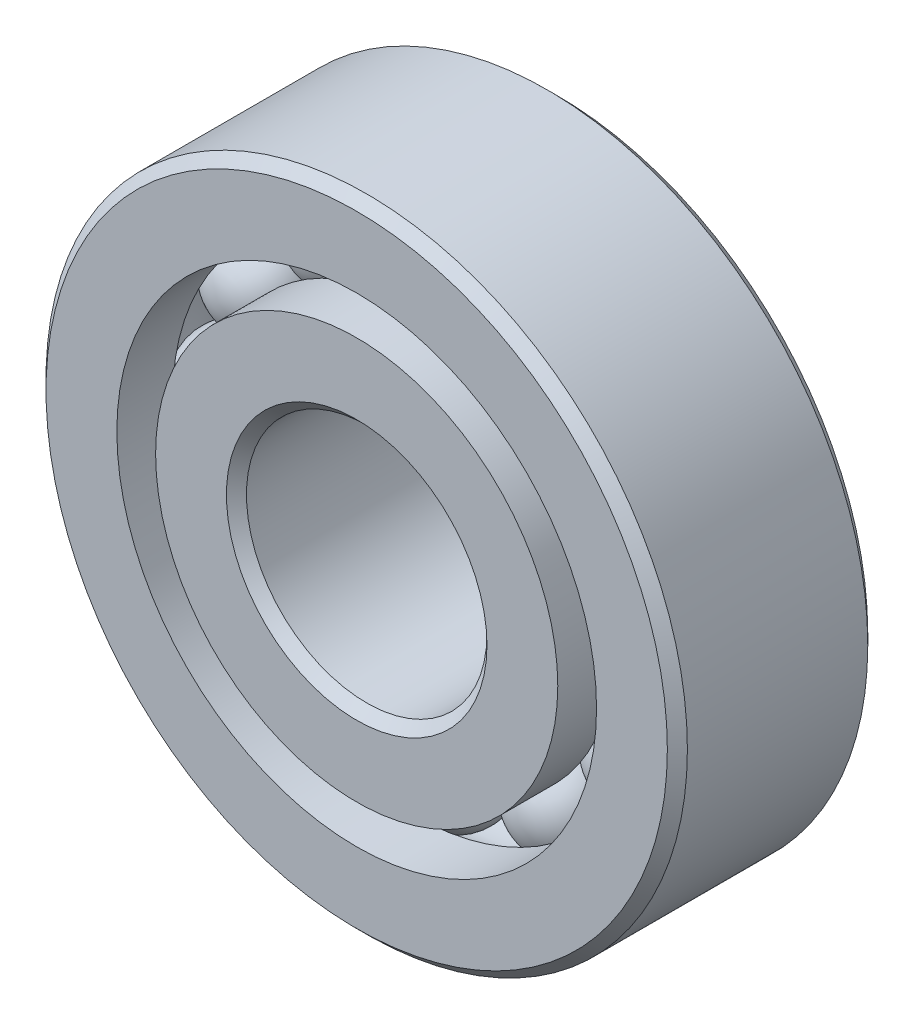
ISO-10303-21;
HEADER;
FILE_DESCRIPTION(('STEP AP214'),'2;1');
FILE_NAME('part.step','',(''),(''),'','','');
FILE_SCHEMA(('AUTOMOTIVE_DESIGN { 1 0 10303 214 1 1 1 1 }'));
ENDSEC;
DATA;
#1=APPLICATION_CONTEXT('core data for automotive mechanical design processes');
#2=APPLICATION_PROTOCOL_DEFINITION('international standard','automotive_design',2000,#1);
#3=PRODUCT_CONTEXT('',#1,'mechanical');
#4=PRODUCT('Part','Part','',(#3));
#5=PRODUCT_RELATED_PRODUCT_CATEGORY('part','',(#4));
#6=PRODUCT_DEFINITION_FORMATION('','',#4);
#7=PRODUCT_DEFINITION_CONTEXT('part definition',#1,'design');
#8=PRODUCT_DEFINITION('design','',#6,#7);
#9=PRODUCT_DEFINITION_SHAPE('','',#8);
#10=(LENGTH_UNIT() NAMED_UNIT(*) SI_UNIT(.MILLI.,.METRE.));
#11=(NAMED_UNIT(*) PLANE_ANGLE_UNIT() SI_UNIT($,.RADIAN.));
#12=(NAMED_UNIT(*) SI_UNIT($,.STERADIAN.) SOLID_ANGLE_UNIT());
#13=UNCERTAINTY_MEASURE_WITH_UNIT(LENGTH_MEASURE(1.E-05),#10,'distance_accuracy_value','');
#14=(GEOMETRIC_REPRESENTATION_CONTEXT(3) GLOBAL_UNCERTAINTY_ASSIGNED_CONTEXT((#13)) GLOBAL_UNIT_ASSIGNED_CONTEXT((#10,
#11,#12)) REPRESENTATION_CONTEXT('',''));
#15=CARTESIAN_POINT('',(0.,0.,0.));
#16=DIRECTION('',(0.,0.,1.));
#17=DIRECTION('',(1.,0.,0.));
#18=AXIS2_PLACEMENT_3D('',#15,#16,#17);
#19=CARTESIAN_POINT('',(-2.18281249999995,3.78074215339647,0.));
#20=DIRECTION('',(0.,0.,1.));
#21=DIRECTION('',(-0.499999999999989,0.866025403784445,0.));
#22=AXIS2_PLACEMENT_3D('',#19,#20,#21);
#23=SPHERICAL_SURFACE('',#22,0.961832467237323);
#24=CARTESIAN_POINT('',(-2.18281249999995,3.78074215339647,0.961832467237323));
#25=VERTEX_POINT('',#24);
#26=VERTEX_LOOP('',#25);
#27=FACE_BOUND('',#26,.T.);
#28=ADVANCED_FACE('F39',(#27),#23,.T.);
#29=CLOSED_SHELL('',(#28));
#30=MANIFOLD_SOLID_BREP('B2',#29);
#31=CARTESIAN_POINT('',(-3.78074215339641,2.18281250000004,0.));
#32=DIRECTION('',(0.,0.,1.));
#33=DIRECTION('',(-0.866025403784433,0.50000000000001,0.));
#34=AXIS2_PLACEMENT_3D('',#31,#32,#33);
#35=SPHERICAL_SURFACE('',#34,0.961832467237323);
#36=CARTESIAN_POINT('',(-3.78074215339641,2.18281250000004,0.961832467237323));
#37=VERTEX_POINT('',#36);
#38=VERTEX_LOOP('',#37);
#39=FACE_BOUND('',#38,.T.);
#40=ADVANCED_FACE('F72',(#39),#35,.T.);
#41=CLOSED_SHELL('',(#40));
#42=MANIFOLD_SOLID_BREP('B6',#41);
#43=CARTESIAN_POINT('',(-4.365625,0.,0.));
#44=DIRECTION('',(0.,0.,1.));
#45=DIRECTION('',(-1.,0.,0.));
#46=AXIS2_PLACEMENT_3D('',#43,#44,#45);
#47=SPHERICAL_SURFACE('',#46,0.961832467237323);
#48=CARTESIAN_POINT('',(-4.365625,0.,0.961832467237323));
#49=VERTEX_POINT('',#48);
#50=VERTEX_LOOP('',#49);
#51=FACE_BOUND('',#50,.T.);
#52=ADVANCED_FACE('F105',(#51),#47,.T.);
#53=CLOSED_SHELL('',(#52));
#54=MANIFOLD_SOLID_BREP('B35',#53);
#55=CARTESIAN_POINT('',(-3.78074215339646,-2.18281249999996,0.));
#56=DIRECTION('',(0.,0.,1.));
#57=DIRECTION('',(-0.866025403784443,-0.499999999999992,0.));
#58=AXIS2_PLACEMENT_3D('',#55,#56,#57);
#59=SPHERICAL_SURFACE('',#58,0.961832467237323);
#60=CARTESIAN_POINT('',(-3.78074215339646,-2.18281249999996,0.961832467237323));
#61=VERTEX_POINT('',#60);
#62=VERTEX_LOOP('',#61);
#63=FACE_BOUND('',#62,.T.);
#64=ADVANCED_FACE('F138',(#63),#59,.T.);
#65=CLOSED_SHELL('',(#64));
#66=MANIFOLD_SOLID_BREP('B68',#65);
#67=CARTESIAN_POINT('',(-2.18281250000003,-3.78074215339642,0.));
#68=DIRECTION('',(0.,0.,1.));
#69=DIRECTION('',(-0.500000000000007,-0.866025403784435,0.));
#70=AXIS2_PLACEMENT_3D('',#67,#68,#69);
#71=SPHERICAL_SURFACE('',#70,0.961832467237323);
#72=CARTESIAN_POINT('',(-2.18281250000003,-3.78074215339642,0.961832467237323));
#73=VERTEX_POINT('',#72);
#74=VERTEX_LOOP('',#73);
#75=FACE_BOUND('',#74,.T.);
#76=ADVANCED_FACE('F169',(#75),#71,.T.);
#77=CLOSED_SHELL('',(#76));
#78=MANIFOLD_SOLID_BREP('B101',#77);
#79=CARTESIAN_POINT('',(0.,-4.365625,0.));
#80=DIRECTION('',(0.,0.,1.));
#81=DIRECTION('',(0.,-1.,0.));
#82=AXIS2_PLACEMENT_3D('',#79,#80,#81);
#83=SPHERICAL_SURFACE('',#82,0.961832467237323);
#84=CARTESIAN_POINT('',(0.,-4.365625,0.961832467237323));
#85=VERTEX_POINT('',#84);
#86=VERTEX_LOOP('',#85);
#87=FACE_BOUND('',#86,.T.);
#88=ADVANCED_FACE('F202',(#87),#83,.T.);
#89=CLOSED_SHELL('',(#88));
#90=MANIFOLD_SOLID_BREP('B134',#89);
#91=CARTESIAN_POINT('',(2.18281249999998,-3.78074215339645,0.));
#92=DIRECTION('',(0.,0.,1.));
#93=DIRECTION('',(0.499999999999995,-0.866025403784442,0.));
#94=AXIS2_PLACEMENT_3D('',#91,#92,#93);
#95=SPHERICAL_SURFACE('',#94,0.961832467237323);
#96=CARTESIAN_POINT('',(2.18281249999998,-3.78074215339645,0.961832467237323));
#97=VERTEX_POINT('',#96);
#98=VERTEX_LOOP('',#97);
#99=FACE_BOUND('',#98,.T.);
#100=ADVANCED_FACE('F233',(#99),#95,.T.);
#101=CLOSED_SHELL('',(#100));
#102=MANIFOLD_SOLID_BREP('B165',#101);
#103=CARTESIAN_POINT('',(3.78074215339643,-2.18281250000002,0.));
#104=DIRECTION('',(0.,0.,1.));
#105=DIRECTION('',(0.866025403784436,-0.500000000000004,0.));
#106=AXIS2_PLACEMENT_3D('',#103,#104,#105);
#107=SPHERICAL_SURFACE('',#106,0.961832467237323);
#108=CARTESIAN_POINT('',(3.78074215339643,-2.18281250000002,0.961832467237323));
#109=VERTEX_POINT('',#108);
#110=VERTEX_LOOP('',#109);
#111=FACE_BOUND('',#110,.T.);
#112=ADVANCED_FACE('F264',(#111),#107,.T.);
#113=CLOSED_SHELL('',(#112));
#114=MANIFOLD_SOLID_BREP('B198',#113);
#115=CARTESIAN_POINT('',(4.365625,0.,0.));
#116=DIRECTION('',(0.,0.,1.));
#117=DIRECTION('',(1.,0.,0.));
#118=AXIS2_PLACEMENT_3D('',#115,#116,#117);
#119=SPHERICAL_SURFACE('',#118,0.961832467237323);
#120=CARTESIAN_POINT('',(4.365625,0.,0.961832467237323));
#121=VERTEX_POINT('',#120);
#122=VERTEX_LOOP('',#121);
#123=FACE_BOUND('',#122,.T.);
#124=ADVANCED_FACE('F295',(#123),#119,.T.);
#125=CLOSED_SHELL('',(#124));
#126=MANIFOLD_SOLID_BREP('B229',#125);
#127=CARTESIAN_POINT('',(3.78074215339644,2.18281249999999,0.));
#128=DIRECTION('',(0.,0.,1.));
#129=DIRECTION('',(0.86602540378444,0.499999999999998,0.));
#130=AXIS2_PLACEMENT_3D('',#127,#128,#129);
#131=SPHERICAL_SURFACE('',#130,0.961832467237323);
#132=CARTESIAN_POINT('',(3.78074215339644,2.18281249999999,0.961832467237323));
#133=VERTEX_POINT('',#132);
#134=VERTEX_LOOP('',#133);
#135=FACE_BOUND('',#134,.T.);
#136=ADVANCED_FACE('F326',(#135),#131,.T.);
#137=CLOSED_SHELL('',(#136));
#138=MANIFOLD_SOLID_BREP('B260',#137);
#139=CARTESIAN_POINT('',(2.1828125,3.78074215339644,0.));
#140=DIRECTION('',(0.,0.,1.));
#141=DIRECTION('',(0.500000000000001,0.866025403784438,0.));
#142=AXIS2_PLACEMENT_3D('',#139,#140,#141);
#143=SPHERICAL_SURFACE('',#142,0.961832467237323);
#144=CARTESIAN_POINT('',(2.1828125,3.78074215339644,0.961832467237323));
#145=VERTEX_POINT('',#144);
#146=VERTEX_LOOP('',#145);
#147=FACE_BOUND('',#146,.T.);
#148=ADVANCED_FACE('F359',(#147),#143,.T.);
#149=CLOSED_SHELL('',(#148));
#150=MANIFOLD_SOLID_BREP('B291',#149);
#151=CARTESIAN_POINT('',(0.,4.365625,0.));
#152=DIRECTION('',(0.,0.,1.));
#153=DIRECTION('',(0.,1.,0.));
#154=AXIS2_PLACEMENT_3D('',#151,#152,#153);
#155=SPHERICAL_SURFACE('',#154,0.961832467237323);
#156=CARTESIAN_POINT('',(0.,4.365625,0.961832467237323));
#157=VERTEX_POINT('',#156);
#158=VERTEX_LOOP('',#157);
#159=FACE_BOUND('',#158,.T.);
#160=ADVANCED_FACE('F394',(#159),#155,.T.);
#161=CLOSED_SHELL('',(#160));
#162=MANIFOLD_SOLID_BREP('B322',#161);
#163=CARTESIAN_POINT('',(0.,3.98183379120879,1.984375));
#164=DIRECTION('',(0.,0.,-1.));
#165=DIRECTION('',(-1.,0.,0.));
#166=AXIS2_PLACEMENT_3D('',#163,#164,#165);
#167=PLANE('',#166);
#168=CARTESIAN_POINT('',(0.,0.,1.984375));
#169=DIRECTION('',(0.,0.,1.));
#170=DIRECTION('',(1.,0.,0.));
#171=AXIS2_PLACEMENT_3D('',#168,#169,#170);
#172=CIRCLE('',#171,2.5796875);
#173=CARTESIAN_POINT('',(2.5796875,0.,1.984375));
#174=VERTEX_POINT('',#173);
#175=EDGE_CURVE('E441',#174,#174,#172,.T.);
#176=ORIENTED_EDGE('',*,*,#175,.F.);
#177=EDGE_LOOP('',(#176));
#178=FACE_BOUND('',#177,.T.);
#179=CARTESIAN_POINT('',(0.,0.,1.984375));
#180=DIRECTION('',(0.,0.,1.));
#181=DIRECTION('',(1.,0.,0.));
#182=AXIS2_PLACEMENT_3D('',#179,#180,#181);
#183=CIRCLE('',#182,3.98183379120879);
#184=CARTESIAN_POINT('',(3.98183379120879,0.,1.984375));
#185=VERTEX_POINT('',#184);
#186=EDGE_CURVE('E393',#185,#185,#183,.T.);
#187=ORIENTED_EDGE('',*,*,#186,.T.);
#188=EDGE_LOOP('',(#187));
#189=FACE_BOUND('',#188,.T.);
#190=ADVANCED_FACE('F413',(#178,#189),#167,.F.);
#191=CARTESIAN_POINT('',(0.,0.,1.984375));
#192=DIRECTION('',(0.,0.,1.));
#193=DIRECTION('',(1.,0.,0.));
#194=AXIS2_PLACEMENT_3D('',#191,#192,#193);
#195=CYLINDRICAL_SURFACE('',#194,3.98183379120879);
#196=ORIENTED_EDGE('',*,*,#186,.F.);
#197=EDGE_LOOP('',(#196));
#198=FACE_BOUND('',#197,.T.);
#199=CARTESIAN_POINT('',(0.,0.,0.881944444444444));
#200=DIRECTION('',(0.,0.,1.));
#201=DIRECTION('',(1.,0.,0.));
#202=AXIS2_PLACEMENT_3D('',#199,#200,#201);
#203=CIRCLE('',#202,3.98183379120879);
#204=CARTESIAN_POINT('',(3.98183379120879,0.,0.881944444444444));
#205=VERTEX_POINT('',#204);
#206=EDGE_CURVE('E419',#205,#205,#203,.T.);
#207=ORIENTED_EDGE('',*,*,#206,.T.);
#208=EDGE_LOOP('',(#207));
#209=FACE_BOUND('',#208,.T.);
#210=ADVANCED_FACE('F448',(#198,#209),#195,.T.);
#211=CARTESIAN_POINT('',(0.,0.,0.));
#212=DIRECTION('',(0.,0.,1.));
#213=DIRECTION('',(1.,0.,0.));
#214=AXIS2_PLACEMENT_3D('',#211,#212,#213);
#215=TOROIDAL_SURFACE('',#214,4.365625,0.961832467237322);
#216=ORIENTED_EDGE('',*,*,#206,.F.);
#217=EDGE_LOOP('',(#216));
#218=FACE_BOUND('',#217,.T.);
#219=CARTESIAN_POINT('',(0.,0.,-0.881944444444446));
#220=DIRECTION('',(0.,0.,1.));
#221=DIRECTION('',(1.,0.,0.));
#222=AXIS2_PLACEMENT_3D('',#219,#220,#221);
#223=CIRCLE('',#222,3.98183379120879);
#224=CARTESIAN_POINT('',(3.98183379120879,0.,-0.881944444444446));
#225=VERTEX_POINT('',#224);
#226=EDGE_CURVE('E423',#225,#225,#223,.T.);
#227=ORIENTED_EDGE('',*,*,#226,.T.);
#228=EDGE_LOOP('',(#227));
#229=FACE_BOUND('',#228,.T.);
#230=ADVANCED_FACE('F452',(#218,#229),#215,.F.);
#231=CARTESIAN_POINT('',(0.,0.,1.984375));
#232=DIRECTION('',(0.,0.,1.));
#233=DIRECTION('',(1.,0.,0.));
#234=AXIS2_PLACEMENT_3D('',#231,#232,#233);
#235=CYLINDRICAL_SURFACE('',#234,3.98183379120879);
#236=ORIENTED_EDGE('',*,*,#226,.F.);
#237=EDGE_LOOP('',(#236));
#238=FACE_BOUND('',#237,.T.);
#239=CARTESIAN_POINT('',(0.,0.,-1.984375));
#240=DIRECTION('',(0.,0.,1.));
#241=DIRECTION('',(1.,0.,0.));
#242=AXIS2_PLACEMENT_3D('',#239,#240,#241);
#243=CIRCLE('',#242,3.98183379120879);
#244=CARTESIAN_POINT('',(3.98183379120879,0.,-1.984375));
#245=VERTEX_POINT('',#244);
#246=EDGE_CURVE('E427',#245,#245,#243,.T.);
#247=ORIENTED_EDGE('',*,*,#246,.T.);
#248=EDGE_LOOP('',(#247));
#249=FACE_BOUND('',#248,.T.);
#250=ADVANCED_FACE('F457',(#238,#249),#235,.T.);
#251=CARTESIAN_POINT('',(0.,2.5796875,-1.984375));
#252=DIRECTION('',(0.,0.,1.));
#253=DIRECTION('',(1.,0.,0.));
#254=AXIS2_PLACEMENT_3D('',#251,#252,#253);
#255=PLANE('',#254);
#256=ORIENTED_EDGE('',*,*,#246,.F.);
#257=EDGE_LOOP('',(#256));
#258=FACE_BOUND('',#257,.T.);
#259=CARTESIAN_POINT('',(0.,0.,-1.984375));
#260=DIRECTION('',(0.,0.,1.));
#261=DIRECTION('',(1.,0.,0.));
#262=AXIS2_PLACEMENT_3D('',#259,#260,#261);
#263=CIRCLE('',#262,2.5796875);
#264=CARTESIAN_POINT('',(2.5796875,0.,-1.984375));
#265=VERTEX_POINT('',#264);
#266=EDGE_CURVE('E432',#265,#265,#263,.T.);
#267=ORIENTED_EDGE('',*,*,#266,.T.);
#268=EDGE_LOOP('',(#267));
#269=FACE_BOUND('',#268,.T.);
#270=ADVANCED_FACE('F463',(#258,#269),#255,.F.);
#271=CARTESIAN_POINT('',(0.,0.,-1.7859375));
#272=DIRECTION('',(0.,0.,-1.));
#273=DIRECTION('',(-1.,0.,0.));
#274=AXIS2_PLACEMENT_3D('',#271,#272,#273);
#275=CONICAL_SURFACE('',#274,2.38125,0.785398163397449);
#276=ORIENTED_EDGE('',*,*,#266,.F.);
#277=EDGE_LOOP('',(#276));
#278=FACE_BOUND('',#277,.T.);
#279=CARTESIAN_POINT('',(0.,0.,-1.7859375));
#280=DIRECTION('',(0.,0.,1.));
#281=DIRECTION('',(1.,0.,0.));
#282=AXIS2_PLACEMENT_3D('',#279,#280,#281);
#283=CIRCLE('',#282,2.38125);
#284=CARTESIAN_POINT('',(2.38125,0.,-1.7859375));
#285=VERTEX_POINT('',#284);
#286=EDGE_CURVE('E435',#285,#285,#283,.T.);
#287=ORIENTED_EDGE('',*,*,#286,.T.);
#288=EDGE_LOOP('',(#287));
#289=FACE_BOUND('',#288,.T.);
#290=ADVANCED_FACE('F467',(#278,#289),#275,.F.);
#291=CARTESIAN_POINT('',(0.,0.,1.984375));
#292=DIRECTION('',(0.,0.,1.));
#293=DIRECTION('',(1.,0.,0.));
#294=AXIS2_PLACEMENT_3D('',#291,#292,#293);
#295=CYLINDRICAL_SURFACE('',#294,2.38125);
#296=ORIENTED_EDGE('',*,*,#286,.F.);
#297=EDGE_LOOP('',(#296));
#298=FACE_BOUND('',#297,.T.);
#299=CARTESIAN_POINT('',(0.,0.,1.7859375));
#300=DIRECTION('',(0.,0.,1.));
#301=DIRECTION('',(1.,0.,0.));
#302=AXIS2_PLACEMENT_3D('',#299,#300,#301);
#303=CIRCLE('',#302,2.38125);
#304=CARTESIAN_POINT('',(2.38125,0.,1.7859375));
#305=VERTEX_POINT('',#304);
#306=EDGE_CURVE('E438',#305,#305,#303,.T.);
#307=ORIENTED_EDGE('',*,*,#306,.T.);
#308=EDGE_LOOP('',(#307));
#309=FACE_BOUND('',#308,.T.);
#310=ADVANCED_FACE('F471',(#298,#309),#295,.F.);
#311=CARTESIAN_POINT('',(0.,0.,1.984375));
#312=DIRECTION('',(0.,0.,1.));
#313=DIRECTION('',(1.,0.,0.));
#314=AXIS2_PLACEMENT_3D('',#311,#312,#313);
#315=CONICAL_SURFACE('',#314,2.5796875,0.785398163397448);
#316=ORIENTED_EDGE('',*,*,#306,.F.);
#317=EDGE_LOOP('',(#316));
#318=FACE_BOUND('',#317,.T.);
#319=ORIENTED_EDGE('',*,*,#175,.T.);
#320=EDGE_LOOP('',(#319));
#321=FACE_BOUND('',#320,.T.);
#322=ADVANCED_FACE('F445',(#318,#321),#315,.F.);
#323=CLOSED_SHELL('',(#190,#210,#230,#250,#270,#290,#310,#322));
#324=MANIFOLD_SOLID_BREP('B355',#323);
#325=CARTESIAN_POINT('',(0.,0.,1.7859375));
#326=DIRECTION('',(0.,0.,-1.));
#327=DIRECTION('',(-1.,0.,0.));
#328=AXIS2_PLACEMENT_3D('',#325,#326,#327);
#329=CONICAL_SURFACE('',#328,6.35,0.785398163397448);
#330=CARTESIAN_POINT('',(0.,0.,1.984375));
#331=DIRECTION('',(0.,0.,1.));
#332=DIRECTION('',(1.,0.,0.));
#333=AXIS2_PLACEMENT_3D('',#330,#331,#332);
#334=CIRCLE('',#333,6.1515625);
#335=CARTESIAN_POINT('',(6.1515625,0.,1.984375));
#336=VERTEX_POINT('',#335);
#337=EDGE_CURVE('E562',#336,#336,#334,.T.);
#338=ORIENTED_EDGE('',*,*,#337,.F.);
#339=EDGE_LOOP('',(#338));
#340=FACE_BOUND('',#339,.T.);
#341=CARTESIAN_POINT('',(0.,0.,1.7859375));
#342=DIRECTION('',(0.,0.,1.));
#343=DIRECTION('',(1.,0.,0.));
#344=AXIS2_PLACEMENT_3D('',#341,#342,#343);
#345=CIRCLE('',#344,6.35);
#346=CARTESIAN_POINT('',(6.35,0.,1.7859375));
#347=VERTEX_POINT('',#346);
#348=EDGE_CURVE('E412',#347,#347,#345,.T.);
#349=ORIENTED_EDGE('',*,*,#348,.T.);
#350=EDGE_LOOP('',(#349));
#351=FACE_BOUND('',#350,.T.);
#352=ADVANCED_FACE('F534',(#340,#351),#329,.T.);
#353=CARTESIAN_POINT('',(0.,0.,1.984375));
#354=DIRECTION('',(0.,0.,1.));
#355=DIRECTION('',(1.,0.,0.));
#356=AXIS2_PLACEMENT_3D('',#353,#354,#355);
#357=CYLINDRICAL_SURFACE('',#356,6.35);
#358=ORIENTED_EDGE('',*,*,#348,.F.);
#359=EDGE_LOOP('',(#358));
#360=FACE_BOUND('',#359,.T.);
#361=CARTESIAN_POINT('',(0.,0.,-1.7859375));
#362=DIRECTION('',(0.,0.,1.));
#363=DIRECTION('',(1.,0.,0.));
#364=AXIS2_PLACEMENT_3D('',#361,#362,#363);
#365=CIRCLE('',#364,6.35);
#366=CARTESIAN_POINT('',(6.35,0.,-1.7859375));
#367=VERTEX_POINT('',#366);
#368=EDGE_CURVE('E540',#367,#367,#365,.T.);
#369=ORIENTED_EDGE('',*,*,#368,.T.);
#370=EDGE_LOOP('',(#369));
#371=FACE_BOUND('',#370,.T.);
#372=ADVANCED_FACE('F569',(#360,#371),#357,.T.);
#373=CARTESIAN_POINT('',(0.,0.,-1.984375));
#374=DIRECTION('',(0.,0.,1.));
#375=DIRECTION('',(1.,0.,0.));
#376=AXIS2_PLACEMENT_3D('',#373,#374,#375);
#377=CONICAL_SURFACE('',#376,6.1515625,0.785398163397448);
#378=ORIENTED_EDGE('',*,*,#368,.F.);
#379=EDGE_LOOP('',(#378));
#380=FACE_BOUND('',#379,.T.);
#381=CARTESIAN_POINT('',(0.,0.,-1.984375));
#382=DIRECTION('',(0.,0.,1.));
#383=DIRECTION('',(1.,0.,0.));
#384=AXIS2_PLACEMENT_3D('',#381,#382,#383);
#385=CIRCLE('',#384,6.1515625);
#386=CARTESIAN_POINT('',(6.1515625,0.,-1.984375));
#387=VERTEX_POINT('',#386);
#388=EDGE_CURVE('E544',#387,#387,#385,.T.);
#389=ORIENTED_EDGE('',*,*,#388,.T.);
#390=EDGE_LOOP('',(#389));
#391=FACE_BOUND('',#390,.T.);
#392=ADVANCED_FACE('F573',(#380,#391),#377,.T.);
#393=CARTESIAN_POINT('',(0.,6.1515625,-1.984375));
#394=DIRECTION('',(0.,0.,1.));
#395=DIRECTION('',(1.,0.,0.));
#396=AXIS2_PLACEMENT_3D('',#393,#394,#395);
#397=PLANE('',#396);
#398=ORIENTED_EDGE('',*,*,#388,.F.);
#399=EDGE_LOOP('',(#398));
#400=FACE_BOUND('',#399,.T.);
#401=CARTESIAN_POINT('',(0.,0.,-1.984375));
#402=DIRECTION('',(0.,0.,1.));
#403=DIRECTION('',(1.,0.,0.));
#404=AXIS2_PLACEMENT_3D('',#401,#402,#403);
#405=CIRCLE('',#404,4.74941620879121);
#406=CARTESIAN_POINT('',(4.74941620879121,0.,-1.984375));
#407=VERTEX_POINT('',#406);
#408=EDGE_CURVE('E548',#407,#407,#405,.T.);
#409=ORIENTED_EDGE('',*,*,#408,.T.);
#410=EDGE_LOOP('',(#409));
#411=FACE_BOUND('',#410,.T.);
#412=ADVANCED_FACE('F578',(#400,#411),#397,.F.);
#413=CARTESIAN_POINT('',(0.,0.,1.984375));
#414=DIRECTION('',(0.,0.,1.));
#415=DIRECTION('',(1.,0.,0.));
#416=AXIS2_PLACEMENT_3D('',#413,#414,#415);
#417=CYLINDRICAL_SURFACE('',#416,4.74941620879121);
#418=ORIENTED_EDGE('',*,*,#408,.F.);
#419=EDGE_LOOP('',(#418));
#420=FACE_BOUND('',#419,.T.);
#421=CARTESIAN_POINT('',(0.,0.,-0.881944444444444));
#422=DIRECTION('',(0.,0.,1.));
#423=DIRECTION('',(1.,0.,0.));
#424=AXIS2_PLACEMENT_3D('',#421,#422,#423);
#425=CIRCLE('',#424,4.74941620879121);
#426=CARTESIAN_POINT('',(4.74941620879121,0.,-0.881944444444444));
#427=VERTEX_POINT('',#426);
#428=EDGE_CURVE('E553',#427,#427,#425,.T.);
#429=ORIENTED_EDGE('',*,*,#428,.T.);
#430=EDGE_LOOP('',(#429));
#431=FACE_BOUND('',#430,.T.);
#432=ADVANCED_FACE('F584',(#420,#431),#417,.F.);
#433=CARTESIAN_POINT('',(0.,0.,0.));
#434=DIRECTION('',(0.,0.,1.));
#435=DIRECTION('',(1.,0.,0.));
#436=AXIS2_PLACEMENT_3D('',#433,#434,#435);
#437=TOROIDAL_SURFACE('',#436,4.365625,0.961832467237323);
#438=ORIENTED_EDGE('',*,*,#428,.F.);
#439=EDGE_LOOP('',(#438));
#440=FACE_BOUND('',#439,.T.);
#441=CARTESIAN_POINT('',(0.,0.,0.881944444444444));
#442=DIRECTION('',(0.,0.,1.));
#443=DIRECTION('',(1.,0.,0.));
#444=AXIS2_PLACEMENT_3D('',#441,#442,#443);
#445=CIRCLE('',#444,4.74941620879121);
#446=CARTESIAN_POINT('',(4.74941620879121,0.,0.881944444444444));
#447=VERTEX_POINT('',#446);
#448=EDGE_CURVE('E556',#447,#447,#445,.T.);
#449=ORIENTED_EDGE('',*,*,#448,.T.);
#450=EDGE_LOOP('',(#449));
#451=FACE_BOUND('',#450,.T.);
#452=ADVANCED_FACE('F588',(#440,#451),#437,.F.);
#453=CARTESIAN_POINT('',(0.,0.,1.984375));
#454=DIRECTION('',(0.,0.,1.));
#455=DIRECTION('',(1.,0.,0.));
#456=AXIS2_PLACEMENT_3D('',#453,#454,#455);
#457=CYLINDRICAL_SURFACE('',#456,4.74941620879121);
#458=ORIENTED_EDGE('',*,*,#448,.F.);
#459=EDGE_LOOP('',(#458));
#460=FACE_BOUND('',#459,.T.);
#461=CARTESIAN_POINT('',(0.,0.,1.984375));
#462=DIRECTION('',(0.,0.,1.));
#463=DIRECTION('',(1.,0.,0.));
#464=AXIS2_PLACEMENT_3D('',#461,#462,#463);
#465=CIRCLE('',#464,4.74941620879121);
#466=CARTESIAN_POINT('',(4.74941620879121,0.,1.984375));
#467=VERTEX_POINT('',#466);
#468=EDGE_CURVE('E559',#467,#467,#465,.T.);
#469=ORIENTED_EDGE('',*,*,#468,.T.);
#470=EDGE_LOOP('',(#469));
#471=FACE_BOUND('',#470,.T.);
#472=ADVANCED_FACE('F592',(#460,#471),#457,.F.);
#473=CARTESIAN_POINT('',(0.,6.1515625,1.984375));
#474=DIRECTION('',(0.,0.,-1.));
#475=DIRECTION('',(-1.,0.,0.));
#476=AXIS2_PLACEMENT_3D('',#473,#474,#475);
#477=PLANE('',#476);
#478=ORIENTED_EDGE('',*,*,#468,.F.);
#479=EDGE_LOOP('',(#478));
#480=FACE_BOUND('',#479,.T.);
#481=ORIENTED_EDGE('',*,*,#337,.T.);
#482=EDGE_LOOP('',(#481));
#483=FACE_BOUND('',#482,.T.);
#484=ADVANCED_FACE('F566',(#480,#483),#477,.F.);
#485=CLOSED_SHELL('',(#352,#372,#392,#412,#432,#452,#472,#484));
#486=MANIFOLD_SOLID_BREP('B388',#485);
#487=ADVANCED_BREP_SHAPE_REPRESENTATION('',(#18,#30,#42,#54,#66,#78,#90,#102,#114,#126,#138,
#150,#162,#324,#486),#14);
#488=SHAPE_DEFINITION_REPRESENTATION(#9,#487);
ENDSEC;
END-ISO-10303-21;
